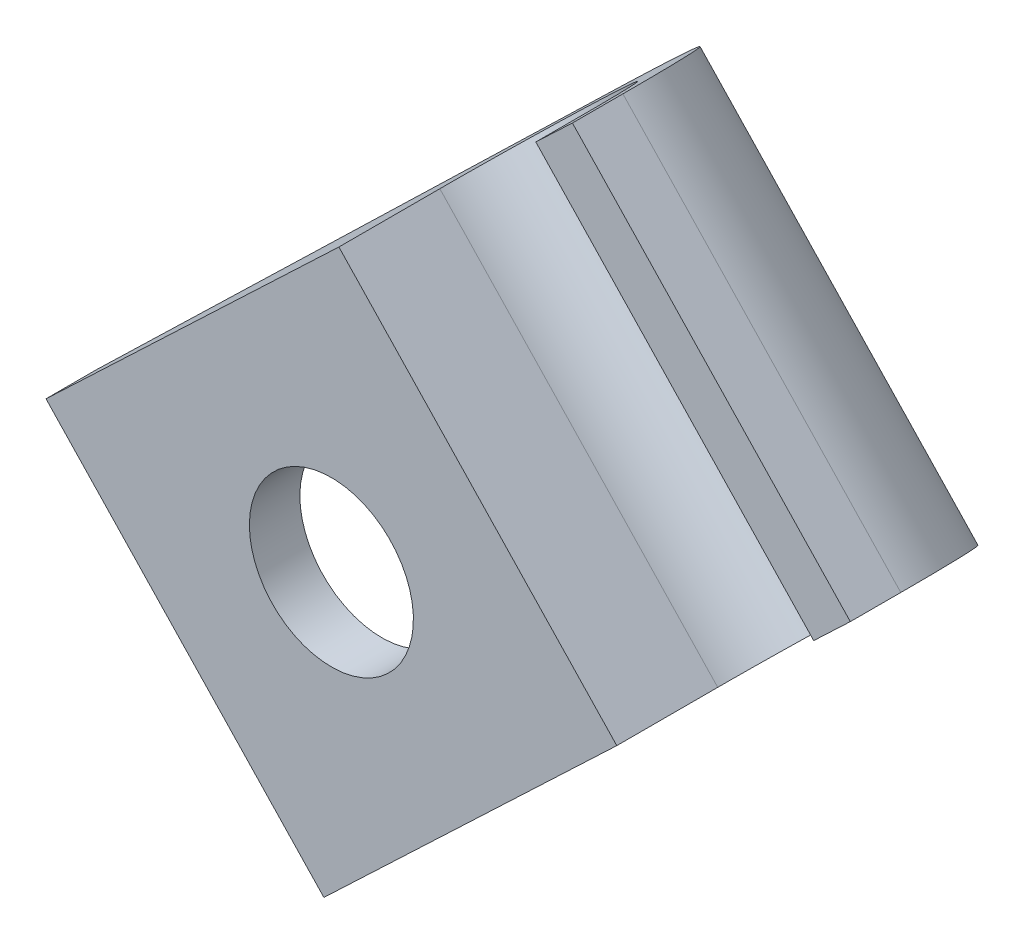
ISO-10303-21;
HEADER;
FILE_DESCRIPTION(('STEP AP214'),'2;1');
FILE_NAME('part.step','',(''),(''),'','','');
FILE_SCHEMA(('AUTOMOTIVE_DESIGN { 1 0 10303 214 1 1 1 1 }'));
ENDSEC;
DATA;
#1=APPLICATION_CONTEXT('core data for automotive mechanical design processes');
#2=APPLICATION_PROTOCOL_DEFINITION('international standard','automotive_design',2000,#1);
#3=PRODUCT_CONTEXT('',#1,'mechanical');
#4=PRODUCT('Part','Part','',(#3));
#5=PRODUCT_RELATED_PRODUCT_CATEGORY('part','',(#4));
#6=PRODUCT_DEFINITION_FORMATION('','',#4);
#7=PRODUCT_DEFINITION_CONTEXT('part definition',#1,'design');
#8=PRODUCT_DEFINITION('design','',#6,#7);
#9=PRODUCT_DEFINITION_SHAPE('','',#8);
#10=(LENGTH_UNIT() NAMED_UNIT(*) SI_UNIT(.MILLI.,.METRE.));
#11=(NAMED_UNIT(*) PLANE_ANGLE_UNIT() SI_UNIT($,.RADIAN.));
#12=(NAMED_UNIT(*) SI_UNIT($,.STERADIAN.) SOLID_ANGLE_UNIT());
#13=UNCERTAINTY_MEASURE_WITH_UNIT(LENGTH_MEASURE(1.E-05),#10,'distance_accuracy_value','');
#14=(GEOMETRIC_REPRESENTATION_CONTEXT(3) GLOBAL_UNCERTAINTY_ASSIGNED_CONTEXT((#13)) GLOBAL_UNIT_ASSIGNED_CONTEXT((#10,
#11,#12)) REPRESENTATION_CONTEXT('',''));
#15=CARTESIAN_POINT('',(0.,0.,0.));
#16=DIRECTION('',(0.,0.,1.));
#17=DIRECTION('',(1.,0.,0.));
#18=AXIS2_PLACEMENT_3D('',#15,#16,#17);
#19=CARTESIAN_POINT('',(51.5322097604457,74.4499868104123,323.969905252864));
#20=DIRECTION('',(0.688295322897612,-0.725430595217263,0.));
#21=DIRECTION('',(0.,1.13666811671174E-13,-1.));
#22=AXIS2_PLACEMENT_3D('',#19,#20,#21);
#23=PLANE('',#22);
#24=DIRECTION('',(0.667371945987254,0.633208734349789,-0.391996663828053));
#25=VECTOR('',#24,1.);
#26=CARTESIAN_POINT('',(43.4708622710946,66.8013050347125,330.319905252865));
#27=LINE('',#26,#25);
#28=CARTESIAN_POINT('',(43.4708622710946,66.8013050347125,330.319905252865));
#29=VERTEX_POINT('',#28);
#30=CARTESIAN_POINT('',(53.6327781179749,76.4430256833881,324.351064138057));
#31=VERTEX_POINT('',#30);
#32=EDGE_CURVE('E288',#29,#31,#27,.T.);
#33=ORIENTED_EDGE('',*,*,#32,.T.);
#34=CARTESIAN_POINT('',(54.9870729701685,77.7279932857121,328.732405252864));
#35=DIRECTION('',(0.688295322897612,-0.725430595217263,0.));
#36=DIRECTION('',(-0.725430595217263,-0.688295322897612,0.));
#37=AXIS2_PLACEMENT_3D('',#34,#35,#36);
#38=CIRCLE('',#37,4.7625);
#39=CARTESIAN_POINT('',(51.5322097604463,74.4499868104123,328.732405252864));
#40=VERTEX_POINT('',#39);
#41=EDGE_CURVE('E176',#40,#31,#38,.T.);
#42=ORIENTED_EDGE('',*,*,#41,.F.);
#43=DIRECTION('',(1.1872860521452E-13,0.,1.));
#44=VECTOR('',#43,1.);
#45=CARTESIAN_POINT('',(51.5322097604457,74.4499868104123,323.969905252864));
#46=LINE('',#45,#44);
#47=CARTESIAN_POINT('',(51.5322097604465,74.4499868104123,330.319905252864));
#48=VERTEX_POINT('',#47);
#49=EDGE_CURVE('E11',#40,#48,#46,.T.);
#50=ORIENTED_EDGE('',*,*,#49,.T.);
#51=DIRECTION('',(0.725430595217263,0.688295322897612,0.));
#52=VECTOR('',#51,1.);
#53=CARTESIAN_POINT('',(51.5322097604465,74.4499868104123,330.319905252864));
#54=LINE('',#53,#52);
#55=EDGE_CURVE('E205',#29,#48,#54,.T.);
#56=ORIENTED_EDGE('',*,*,#55,.F.);
#57=EDGE_LOOP('',(#33,#42,#50,#56));
#58=FACE_BOUND('',#57,.T.);
#59=ADVANCED_FACE('F16',(#58),#23,.T.);
#60=CARTESIAN_POINT('',(58.0882227110455,67.5402603909678,323.969905252863));
#61=DIRECTION('',(-0.688295322897612,0.725430595217263,0.));
#62=DIRECTION('',(1.19799423450876E-13,0.,1.));
#63=AXIS2_PLACEMENT_3D('',#60,#61,#62);
#64=PLANE('',#63);
#65=DIRECTION('',(-0.667371945987254,-0.633208734349789,0.391996663828053));
#66=VECTOR('',#65,1.);
#67=CARTESIAN_POINT('',(50.0268752216944,59.8915786152681,330.319905252864));
#68=LINE('',#67,#66);
#69=CARTESIAN_POINT('',(60.1887910685746,69.5332992639437,324.351064138056));
#70=VERTEX_POINT('',#69);
#71=CARTESIAN_POINT('',(50.0268752216944,59.8915786152681,330.319905252864));
#72=VERTEX_POINT('',#71);
#73=EDGE_CURVE('E209',#70,#72,#68,.T.);
#74=ORIENTED_EDGE('',*,*,#73,.T.);
#75=DIRECTION('',(-0.725430595217263,-0.688295322897612,0.));
#76=VECTOR('',#75,1.);
#77=CARTESIAN_POINT('',(58.0882227110462,67.5402603909678,330.319905252863));
#78=LINE('',#77,#76);
#79=CARTESIAN_POINT('',(58.0882227110462,67.5402603909678,330.319905252863));
#80=VERTEX_POINT('',#79);
#81=EDGE_CURVE('E217',#80,#72,#78,.T.);
#82=ORIENTED_EDGE('',*,*,#81,.F.);
#83=DIRECTION('',(1.1872860521452E-13,0.,1.));
#84=VECTOR('',#83,1.);
#85=CARTESIAN_POINT('',(58.0882227110455,67.5402603909678,323.969905252863));
#86=LINE('',#85,#84);
#87=CARTESIAN_POINT('',(58.0882227110461,67.5402603909678,328.732405252863));
#88=VERTEX_POINT('',#87);
#89=EDGE_CURVE('E27',#88,#80,#86,.T.);
#90=ORIENTED_EDGE('',*,*,#89,.F.);
#91=CARTESIAN_POINT('',(61.5430859207683,70.8182668662677,328.732405252863));
#92=DIRECTION('',(0.688295322897612,-0.725430595217263,0.));
#93=DIRECTION('',(0.725430595217263,0.688295322897612,0.));
#94=AXIS2_PLACEMENT_3D('',#91,#92,#93);
#95=CIRCLE('',#94,4.7625);
#96=EDGE_CURVE('E150',#88,#70,#95,.T.);
#97=ORIENTED_EDGE('',*,*,#96,.T.);
#98=EDGE_LOOP('',(#74,#82,#90,#97));
#99=FACE_BOUND('',#98,.T.);
#100=ADVANCED_FACE('F326',(#99),#64,.T.);
#101=CARTESIAN_POINT('',(51.5322097604457,74.4499868104123,323.969905252864));
#102=DIRECTION('',(-0.725430595217263,-0.688295322897612,0.));
#103=DIRECTION('',(-0.688295322897612,0.725430595217263,0.));
#104=AXIS2_PLACEMENT_3D('',#101,#102,#103);
#105=PLANE('',#104);
#106=DIRECTION('',(-0.688295322897612,0.725430595217263,0.));
#107=VECTOR('',#106,1.);
#108=CARTESIAN_POINT('',(61.702968713503,63.7304897054977,328.732405252863));
#109=LINE('',#108,#107);
#110=EDGE_CURVE('E260',#88,#40,#109,.T.);
#111=ORIENTED_EDGE('',*,*,#110,.F.);
#112=ORIENTED_EDGE('',*,*,#89,.T.);
#113=DIRECTION('',(0.688295322897612,-0.725430595217263,0.));
#114=VECTOR('',#113,1.);
#115=CARTESIAN_POINT('',(51.5322097604465,74.4499868104123,330.319905252864));
#116=LINE('',#115,#114);
#117=EDGE_CURVE('E221',#48,#80,#116,.T.);
#118=ORIENTED_EDGE('',*,*,#117,.F.);
#119=ORIENTED_EDGE('',*,*,#49,.F.);
#120=EDGE_LOOP('',(#111,#112,#118,#119));
#121=FACE_BOUND('',#120,.T.);
#122=ADVANCED_FACE('F332',(#121),#105,.T.);
#123=CARTESIAN_POINT('',(53.8944041450686,78.8796143556195,328.732405252864));
#124=DIRECTION('',(0.688295322897612,-0.725430595217263,0.));
#125=DIRECTION('',(0.,1.13666811671174E-13,-1.));
#126=AXIS2_PLACEMENT_3D('',#123,#124,#125);
#127=PLANE('',#126);
#128=CARTESIAN_POINT('',(53.8944041450686,78.8796143556195,328.732405252864));
#129=DIRECTION('',(-0.688295322897612,0.725430595217263,0.));
#130=DIRECTION('',(-0.725430595217263,-0.688295322897612,0.));
#131=AXIS2_PLACEMENT_3D('',#128,#129,#130);
#132=CIRCLE('',#131,3.175);
#133=CARTESIAN_POINT('',(56.1976462848834,81.0649520058194,328.732405252863));
#134=VERTEX_POINT('',#133);
#135=CARTESIAN_POINT('',(51.5911620052538,76.6942767054196,328.732405252864));
#136=VERTEX_POINT('',#135);
#137=EDGE_CURVE('E225',#134,#136,#132,.T.);
#138=ORIENTED_EDGE('',*,*,#137,.F.);
#139=DIRECTION('',(-1.1872860521452E-13,0.,-1.));
#140=VECTOR('',#139,1.);
#141=CARTESIAN_POINT('',(56.1976462848834,81.0649520058194,328.732405252863));
#142=LINE('',#141,#140);
#143=CARTESIAN_POINT('',(56.1976462848836,81.0649520058194,330.319905252864));
#144=VERTEX_POINT('',#143);
#145=EDGE_CURVE('E296',#144,#134,#142,.T.);
#146=ORIENTED_EDGE('',*,*,#145,.F.);
#147=DIRECTION('',(-0.725430595217263,-0.688295322897612,0.));
#148=VECTOR('',#147,1.);
#149=CARTESIAN_POINT('',(56.1976462848836,81.0649520058194,330.319905252864));
#150=LINE('',#149,#148);
#151=CARTESIAN_POINT('',(57.349267354791,82.1576208309194,330.319905252863));
#152=VERTEX_POINT('',#151);
#153=EDGE_CURVE('E170',#152,#144,#150,.T.);
#154=ORIENTED_EDGE('',*,*,#153,.F.);
#155=DIRECTION('',(1.1872860521452E-13,0.,1.));
#156=VECTOR('',#155,1.);
#157=CARTESIAN_POINT('',(57.349267354791,82.1576208309194,330.319905252863));
#158=LINE('',#157,#156);
#159=CARTESIAN_POINT('',(57.3492673547908,82.1576208309194,328.732405252863));
#160=VERTEX_POINT('',#159);
#161=EDGE_CURVE('E163',#160,#152,#158,.T.);
#162=ORIENTED_EDGE('',*,*,#161,.F.);
#163=CARTESIAN_POINT('',(53.8944041450686,78.8796143556195,328.732405252864));
#164=DIRECTION('',(0.688295322897612,-0.725430595217263,0.));
#165=DIRECTION('',(0.725430595217263,0.688295322897612,0.));
#166=AXIS2_PLACEMENT_3D('',#163,#164,#165);
#167=CIRCLE('',#166,4.7625);
#168=CARTESIAN_POINT('',(52.5401092928749,77.5946467532955,324.351064138057));
#169=VERTEX_POINT('',#168);
#170=EDGE_CURVE('E167',#169,#160,#167,.T.);
#171=ORIENTED_EDGE('',*,*,#170,.F.);
#172=DIRECTION('',(0.667371945987254,0.633208734349789,-0.391996663828053));
#173=VECTOR('',#172,1.);
#174=CARTESIAN_POINT('',(42.3781934459947,67.95292610462,330.319905252865));
#175=LINE('',#174,#173);
#176=CARTESIAN_POINT('',(42.3781934459947,67.95292610462,330.319905252865));
#177=VERTEX_POINT('',#176);
#178=EDGE_CURVE('E230',#177,#169,#175,.T.);
#179=ORIENTED_EDGE('',*,*,#178,.F.);
#180=DIRECTION('',(-1.1872860521452E-13,0.,-1.));
#181=VECTOR('',#180,1.);
#182=CARTESIAN_POINT('',(42.3781934459949,67.95292610462,331.907405252865));
#183=LINE('',#182,#181);
#184=CARTESIAN_POINT('',(42.3781934459949,67.95292610462,331.907405252865));
#185=VERTEX_POINT('',#184);
#186=EDGE_CURVE('E89',#185,#177,#183,.T.);
#187=ORIENTED_EDGE('',*,*,#186,.F.);
#188=DIRECTION('',(-0.725430595217263,-0.688295322897612,0.));
#189=VECTOR('',#188,1.);
#190=CARTESIAN_POINT('',(51.5911620052541,76.6942767054196,331.907405252864));
#191=LINE('',#190,#189);
#192=CARTESIAN_POINT('',(51.5911620052541,76.6942767054196,331.907405252864));
#193=VERTEX_POINT('',#192);
#194=EDGE_CURVE('E203',#193,#185,#191,.T.);
#195=ORIENTED_EDGE('',*,*,#194,.F.);
#196=DIRECTION('',(1.18530428602912E-13,0.,1.));
#197=VECTOR('',#196,1.);
#198=CARTESIAN_POINT('',(51.5911620052538,76.6942767054196,328.732405252864));
#199=LINE('',#198,#197);
#200=EDGE_CURVE('E236',#136,#193,#199,.T.);
#201=ORIENTED_EDGE('',*,*,#200,.F.);
#202=EDGE_LOOP('',(#138,#146,#154,#162,#171,#179,#187,#195,#201));
#203=FACE_BOUND('',#202,.T.);
#204=ADVANCED_FACE('F18',(#203),#127,.F.);
#205=CARTESIAN_POINT('',(62.6357547458682,69.6666457963603,328.732405252863));
#206=DIRECTION('',(0.688295322897612,-0.725430595217263,0.));
#207=DIRECTION('',(0.,1.13666811671174E-13,-1.));
#208=AXIS2_PLACEMENT_3D('',#205,#206,#207);
#209=PLANE('',#208);
#210=CARTESIAN_POINT('',(62.6357547458682,69.6666457963603,328.732405252863));
#211=DIRECTION('',(-0.688295322897612,0.725430595217263,0.));
#212=DIRECTION('',(-0.725430595217263,-0.688295322897612,0.));
#213=AXIS2_PLACEMENT_3D('',#210,#211,#212);
#214=CIRCLE('',#213,3.175);
#215=CARTESIAN_POINT('',(64.938996885683,71.8519834465602,328.732405252862));
#216=VERTEX_POINT('',#215);
#217=CARTESIAN_POINT('',(60.3325126060534,67.4813081461604,328.732405252863));
#218=VERTEX_POINT('',#217);
#219=EDGE_CURVE('E211',#216,#218,#214,.T.);
#220=ORIENTED_EDGE('',*,*,#219,.T.);
#221=DIRECTION('',(1.18530428602912E-13,0.,1.));
#222=VECTOR('',#221,1.);
#223=CARTESIAN_POINT('',(60.3325126060534,67.4813081461604,328.732405252863));
#224=LINE('',#223,#222);
#225=CARTESIAN_POINT('',(60.3325126060538,67.4813081461604,331.907405252863));
#226=VERTEX_POINT('',#225);
#227=EDGE_CURVE('E233',#218,#226,#224,.T.);
#228=ORIENTED_EDGE('',*,*,#227,.T.);
#229=DIRECTION('',(-0.725430595217263,-0.688295322897612,0.));
#230=VECTOR('',#229,1.);
#231=CARTESIAN_POINT('',(60.3325126060538,67.4813081461604,331.907405252863));
#232=LINE('',#231,#230);
#233=CARTESIAN_POINT('',(51.1195440467946,58.7399575453607,331.907405252864));
#234=VERTEX_POINT('',#233);
#235=EDGE_CURVE('E245',#226,#234,#232,.T.);
#236=ORIENTED_EDGE('',*,*,#235,.T.);
#237=DIRECTION('',(-1.1872860521452E-13,0.,-1.));
#238=VECTOR('',#237,1.);
#239=CARTESIAN_POINT('',(51.1195440467946,58.7399575453607,331.907405252864));
#240=LINE('',#239,#238);
#241=CARTESIAN_POINT('',(51.1195440467944,58.7399575453607,330.319905252864));
#242=VERTEX_POINT('',#241);
#243=EDGE_CURVE('E101',#234,#242,#240,.T.);
#244=ORIENTED_EDGE('',*,*,#243,.T.);
#245=DIRECTION('',(0.667371945987254,0.633208734349789,-0.391996663828053));
#246=VECTOR('',#245,1.);
#247=CARTESIAN_POINT('',(51.1195440467944,58.7399575453607,330.319905252864));
#248=LINE('',#247,#246);
#249=CARTESIAN_POINT('',(61.2814598936746,68.3816781940363,324.351064138056));
#250=VERTEX_POINT('',#249);
#251=EDGE_CURVE('E248',#242,#250,#248,.T.);
#252=ORIENTED_EDGE('',*,*,#251,.T.);
#253=CARTESIAN_POINT('',(62.6357547458682,69.6666457963603,328.732405252863));
#254=DIRECTION('',(0.688295322897612,-0.725430595217263,0.));
#255=DIRECTION('',(0.725430595217263,0.688295322897612,0.));
#256=AXIS2_PLACEMENT_3D('',#253,#254,#255);
#257=CIRCLE('',#256,4.7625);
#258=CARTESIAN_POINT('',(66.0906179555904,72.9446522716602,328.732405252862));
#259=VERTEX_POINT('',#258);
#260=EDGE_CURVE('E186',#250,#259,#257,.T.);
#261=ORIENTED_EDGE('',*,*,#260,.T.);
#262=DIRECTION('',(1.1872860521452E-13,0.,1.));
#263=VECTOR('',#262,1.);
#264=CARTESIAN_POINT('',(66.0906179555906,72.9446522716602,330.319905252862));
#265=LINE('',#264,#263);
#266=CARTESIAN_POINT('',(66.0906179555906,72.9446522716602,330.319905252862));
#267=VERTEX_POINT('',#266);
#268=EDGE_CURVE('E182',#259,#267,#265,.T.);
#269=ORIENTED_EDGE('',*,*,#268,.T.);
#270=DIRECTION('',(-0.725430595217263,-0.688295322897612,0.));
#271=VECTOR('',#270,1.);
#272=CARTESIAN_POINT('',(64.9389968856832,71.8519834465602,330.319905252863));
#273=LINE('',#272,#271);
#274=CARTESIAN_POINT('',(64.9389968856832,71.8519834465602,330.319905252863));
#275=VERTEX_POINT('',#274);
#276=EDGE_CURVE('E299',#267,#275,#273,.T.);
#277=ORIENTED_EDGE('',*,*,#276,.T.);
#278=DIRECTION('',(-1.1872860521452E-13,0.,-1.));
#279=VECTOR('',#278,1.);
#280=CARTESIAN_POINT('',(64.938996885683,71.8519834465602,328.732405252862));
#281=LINE('',#280,#279);
#282=EDGE_CURVE('E41',#275,#216,#281,.T.);
#283=ORIENTED_EDGE('',*,*,#282,.T.);
#284=EDGE_LOOP('',(#220,#228,#236,#244,#252,#261,#269,#277,#283));
#285=FACE_BOUND('',#284,.T.);
#286=ADVANCED_FACE('F322',(#285),#209,.T.);
#287=CARTESIAN_POINT('',(64.938996885683,71.8519834465602,328.732405252862));
#288=DIRECTION('',(0.725430595217263,0.688295322897612,0.));
#289=DIRECTION('',(0.,-1.24118311207363E-13,-1.));
#290=AXIS2_PLACEMENT_3D('',#287,#288,#289);
#291=PLANE('',#290);
#292=ORIENTED_EDGE('',*,*,#145,.T.);
#293=DIRECTION('',(-0.688295322897612,0.725430595217263,0.));
#294=VECTOR('',#293,1.);
#295=CARTESIAN_POINT('',(64.938996885683,71.8519834465602,328.732405252862));
#296=LINE('',#295,#294);
#297=EDGE_CURVE('E215',#216,#134,#296,.T.);
#298=ORIENTED_EDGE('',*,*,#297,.F.);
#299=ORIENTED_EDGE('',*,*,#282,.F.);
#300=DIRECTION('',(-0.688295322897612,0.725430595217263,0.));
#301=VECTOR('',#300,1.);
#302=CARTESIAN_POINT('',(64.9389968856832,71.8519834465602,330.319905252863));
#303=LINE('',#302,#301);
#304=EDGE_CURVE('E241',#275,#144,#303,.T.);
#305=ORIENTED_EDGE('',*,*,#304,.T.);
#306=EDGE_LOOP('',(#292,#298,#299,#305));
#307=FACE_BOUND('',#306,.T.);
#308=ADVANCED_FACE('F309',(#307),#291,.F.);
#309=CARTESIAN_POINT('',(64.9389968856832,71.8519834465602,330.319905252863));
#310=DIRECTION('',(-1.18629516908716E-13,0.,-1.));
#311=DIRECTION('',(-1.,0.,1.18629516908716E-13));
#312=AXIS2_PLACEMENT_3D('',#309,#310,#311);
#313=PLANE('',#312);
#314=ORIENTED_EDGE('',*,*,#153,.T.);
#315=ORIENTED_EDGE('',*,*,#304,.F.);
#316=ORIENTED_EDGE('',*,*,#276,.F.);
#317=DIRECTION('',(-0.688295322897612,0.725430595217263,0.));
#318=VECTOR('',#317,1.);
#319=CARTESIAN_POINT('',(66.0906179555906,72.9446522716602,330.319905252862));
#320=LINE('',#319,#318);
#321=EDGE_CURVE('E175',#267,#152,#320,.T.);
#322=ORIENTED_EDGE('',*,*,#321,.T.);
#323=EDGE_LOOP('',(#314,#315,#316,#322));
#324=FACE_BOUND('',#323,.T.);
#325=ADVANCED_FACE('F313',(#324),#313,.F.);
#326=CARTESIAN_POINT('',(66.0906179555906,72.9446522716602,330.319905252862));
#327=DIRECTION('',(-0.725430595217263,-0.688295322897612,0.));
#328=DIRECTION('',(-0.688295322897612,0.725430595217263,0.));
#329=AXIS2_PLACEMENT_3D('',#326,#327,#328);
#330=PLANE('',#329);
#331=ORIENTED_EDGE('',*,*,#161,.T.);
#332=ORIENTED_EDGE('',*,*,#321,.F.);
#333=ORIENTED_EDGE('',*,*,#268,.F.);
#334=DIRECTION('',(-0.688295322897612,0.725430595217263,0.));
#335=VECTOR('',#334,1.);
#336=CARTESIAN_POINT('',(66.0906179555904,72.9446522716602,328.732405252862));
#337=LINE('',#336,#335);
#338=EDGE_CURVE('E179',#259,#160,#337,.T.);
#339=ORIENTED_EDGE('',*,*,#338,.T.);
#340=EDGE_LOOP('',(#331,#332,#333,#339));
#341=FACE_BOUND('',#340,.T.);
#342=ADVANCED_FACE('F180',(#341),#330,.F.);
#343=CARTESIAN_POINT('',(62.6357547458682,69.6666457963603,328.732405252863));
#344=DIRECTION('',(-0.688295322897612,0.725430595217263,0.));
#345=DIRECTION('',(0.725430595217263,0.688295322897612,0.));
#346=AXIS2_PLACEMENT_3D('',#343,#344,#345);
#347=CYLINDRICAL_SURFACE('',#346,4.7625);
#348=ORIENTED_EDGE('',*,*,#170,.T.);
#349=ORIENTED_EDGE('',*,*,#338,.F.);
#350=ORIENTED_EDGE('',*,*,#260,.F.);
#351=DIRECTION('',(-0.688295322897612,0.725430595217263,0.));
#352=VECTOR('',#351,1.);
#353=CARTESIAN_POINT('',(61.2814598936746,68.3816781940363,324.351064138056));
#354=LINE('',#353,#352);
#355=EDGE_CURVE('E253',#250,#70,#354,.T.);
#356=ORIENTED_EDGE('',*,*,#355,.T.);
#357=ORIENTED_EDGE('',*,*,#96,.F.);
#358=ORIENTED_EDGE('',*,*,#110,.T.);
#359=ORIENTED_EDGE('',*,*,#41,.T.);
#360=DIRECTION('',(-0.688295322897612,0.725430595217263,0.));
#361=VECTOR('',#360,1.);
#362=CARTESIAN_POINT('',(61.2814598936746,68.3816781940363,324.351064138056));
#363=LINE('',#362,#361);
#364=EDGE_CURVE('E20',#31,#169,#363,.T.);
#365=ORIENTED_EDGE('',*,*,#364,.T.);
#366=EDGE_LOOP('',(#348,#349,#350,#356,#357,#358,#359,#365));
#367=FACE_BOUND('',#366,.T.);
#368=ADVANCED_FACE('F189',(#367),#347,.T.);
#369=CARTESIAN_POINT('',(51.1195440467946,58.7399575453607,331.907405252864));
#370=DIRECTION('',(0.725430595217263,0.688295322897612,0.));
#371=DIRECTION('',(0.,-1.24118311207363E-13,-1.));
#372=AXIS2_PLACEMENT_3D('',#369,#370,#371);
#373=PLANE('',#372);
#374=ORIENTED_EDGE('',*,*,#186,.T.);
#375=DIRECTION('',(-0.688295322897612,0.725430595217263,0.));
#376=VECTOR('',#375,1.);
#377=CARTESIAN_POINT('',(51.1195440467944,58.7399575453607,330.319905252864));
#378=LINE('',#377,#376);
#379=EDGE_CURVE('E138',#29,#177,#378,.T.);
#380=ORIENTED_EDGE('',*,*,#379,.F.);
#381=DIRECTION('',(-0.688295322897612,0.725430595217263,0.));
#382=VECTOR('',#381,1.);
#383=CARTESIAN_POINT('',(43.4708622710946,66.8013050347125,330.319905252865));
#384=LINE('',#383,#382);
#385=EDGE_CURVE('E210',#72,#29,#384,.T.);
#386=ORIENTED_EDGE('',*,*,#385,.F.);
#387=DIRECTION('',(-0.688295322897612,0.725430595217263,0.));
#388=VECTOR('',#387,1.);
#389=CARTESIAN_POINT('',(51.1195440467944,58.7399575453607,330.319905252864));
#390=LINE('',#389,#388);
#391=EDGE_CURVE('E246',#242,#72,#390,.T.);
#392=ORIENTED_EDGE('',*,*,#391,.F.);
#393=ORIENTED_EDGE('',*,*,#243,.F.);
#394=DIRECTION('',(-0.688295322897612,0.725430595217263,0.));
#395=VECTOR('',#394,1.);
#396=CARTESIAN_POINT('',(51.1195440467946,58.7399575453607,331.907405252864));
#397=LINE('',#396,#395);
#398=EDGE_CURVE('E242',#234,#185,#397,.T.);
#399=ORIENTED_EDGE('',*,*,#398,.T.);
#400=EDGE_LOOP('',(#374,#380,#386,#392,#393,#399));
#401=FACE_BOUND('',#400,.T.);
#402=ADVANCED_FACE('F368',(#401),#373,.F.);
#403=CARTESIAN_POINT('',(60.3325126060534,67.4813081461604,328.732405252863));
#404=DIRECTION('',(-0.725430595217263,-0.688295322897612,0.));
#405=DIRECTION('',(-0.688295322897612,0.725430595217263,0.));
#406=AXIS2_PLACEMENT_3D('',#403,#404,#405);
#407=PLANE('',#406);
#408=ORIENTED_EDGE('',*,*,#200,.T.);
#409=DIRECTION('',(-0.688295322897612,0.725430595217263,0.));
#410=VECTOR('',#409,1.);
#411=CARTESIAN_POINT('',(60.3325126060538,67.4813081461604,331.907405252863));
#412=LINE('',#411,#410);
#413=EDGE_CURVE('E256',#226,#193,#412,.T.);
#414=ORIENTED_EDGE('',*,*,#413,.F.);
#415=ORIENTED_EDGE('',*,*,#227,.F.);
#416=DIRECTION('',(-0.688295322897612,0.725430595217263,0.));
#417=VECTOR('',#416,1.);
#418=CARTESIAN_POINT('',(60.3325126060534,67.4813081461604,328.732405252863));
#419=LINE('',#418,#417);
#420=EDGE_CURVE('E216',#218,#136,#419,.T.);
#421=ORIENTED_EDGE('',*,*,#420,.T.);
#422=EDGE_LOOP('',(#408,#414,#415,#421));
#423=FACE_BOUND('',#422,.T.);
#424=ADVANCED_FACE('F385',(#423),#407,.F.);
#425=CARTESIAN_POINT('',(62.6357547458682,69.6666457963603,328.732405252863));
#426=DIRECTION('',(-0.688295322897612,0.725430595217263,0.));
#427=DIRECTION('',(0.725430595217263,0.688295322897612,0.));
#428=AXIS2_PLACEMENT_3D('',#425,#426,#427);
#429=CYLINDRICAL_SURFACE('',#428,3.175);
#430=ORIENTED_EDGE('',*,*,#137,.T.);
#431=ORIENTED_EDGE('',*,*,#420,.F.);
#432=ORIENTED_EDGE('',*,*,#219,.F.);
#433=ORIENTED_EDGE('',*,*,#297,.T.);
#434=EDGE_LOOP('',(#430,#431,#432,#433));
#435=FACE_BOUND('',#434,.T.);
#436=ADVANCED_FACE('F305',(#435),#429,.F.);
#437=CARTESIAN_POINT('',(51.1195440467944,58.7399575453607,330.319905252864));
#438=DIRECTION('',(0.284366373164018,0.269809470304261,0.919966638279713));
#439=DIRECTION('',(0.688295322897471,-0.725430595217397,0.));
#440=AXIS2_PLACEMENT_3D('',#437,#438,#439);
#441=PLANE('',#440);
#442=ORIENTED_EDGE('',*,*,#364,.F.);
#443=ORIENTED_EDGE('',*,*,#32,.F.);
#444=ORIENTED_EDGE('',*,*,#379,.T.);
#445=ORIENTED_EDGE('',*,*,#178,.T.);
#446=EDGE_LOOP('',(#442,#443,#444,#445));
#447=FACE_BOUND('',#446,.T.);
#448=ADVANCED_FACE('F339',(#447),#441,.F.);
#449=CARTESIAN_POINT('',(51.1195440467944,58.7399575453607,330.319905252864));
#450=DIRECTION('',(0.284366373164018,0.269809470304261,0.919966638279713));
#451=DIRECTION('',(0.688295322897471,-0.725430595217397,0.));
#452=AXIS2_PLACEMENT_3D('',#449,#450,#451);
#453=PLANE('',#452);
#454=ORIENTED_EDGE('',*,*,#73,.F.);
#455=ORIENTED_EDGE('',*,*,#355,.F.);
#456=ORIENTED_EDGE('',*,*,#251,.F.);
#457=ORIENTED_EDGE('',*,*,#391,.T.);
#458=EDGE_LOOP('',(#454,#455,#456,#457));
#459=FACE_BOUND('',#458,.T.);
#460=ADVANCED_FACE('F336',(#459),#453,.F.);
#461=CARTESIAN_POINT('',(58.0882227110462,67.5402603909678,330.319905252863));
#462=DIRECTION('',(-1.1872860521452E-13,0.,-1.));
#463=DIRECTION('',(-1.,0.,1.1872860521452E-13));
#464=AXIS2_PLACEMENT_3D('',#461,#462,#463);
#465=PLANE('',#464);
#466=CARTESIAN_POINT('',(51.3553530260241,67.7171171253902,330.319905252864));
#467=DIRECTION('',(1.1872860521452E-13,0.,1.));
#468=DIRECTION('',(0.688295322897629,-0.725430595217247,0.));
#469=AXIS2_PLACEMENT_3D('',#466,#467,#468);
#470=CIRCLE('',#469,2.5796875);
#471=CARTESIAN_POINT('',(53.1309398668116,65.8457328867906,330.319905252864));
#472=VERTEX_POINT('',#471);
#473=EDGE_CURVE('E229',#472,#472,#470,.T.);
#474=ORIENTED_EDGE('',*,*,#473,.T.);
#475=EDGE_LOOP('',(#474));
#476=FACE_BOUND('',#475,.T.);
#477=ORIENTED_EDGE('',*,*,#117,.T.);
#478=ORIENTED_EDGE('',*,*,#81,.T.);
#479=ORIENTED_EDGE('',*,*,#385,.T.);
#480=ORIENTED_EDGE('',*,*,#55,.T.);
#481=EDGE_LOOP('',(#477,#478,#479,#480));
#482=FACE_BOUND('',#481,.T.);
#483=ADVANCED_FACE('F342',(#476,#482),#465,.T.);
#484=CARTESIAN_POINT('',(60.3325126060538,67.4813081461604,331.907405252863));
#485=DIRECTION('',(-1.18639765588877E-13,0.,-1.));
#486=DIRECTION('',(-1.,0.,1.18639765588877E-13));
#487=AXIS2_PLACEMENT_3D('',#484,#485,#486);
#488=PLANE('',#487);
#489=CARTESIAN_POINT('',(51.3553530260243,67.7171171253902,331.907405252864));
#490=DIRECTION('',(-1.1872860521452E-13,0.,-1.));
#491=DIRECTION('',(0.688295322897612,-0.725430595217262,0.));
#492=AXIS2_PLACEMENT_3D('',#489,#490,#491);
#493=CIRCLE('',#492,2.5796875);
#494=CARTESIAN_POINT('',(53.1309398668118,65.8457328867906,331.907405252864));
#495=VERTEX_POINT('',#494);
#496=EDGE_CURVE('E201',#495,#495,#493,.T.);
#497=ORIENTED_EDGE('',*,*,#496,.T.);
#498=EDGE_LOOP('',(#497));
#499=FACE_BOUND('',#498,.T.);
#500=ORIENTED_EDGE('',*,*,#194,.T.);
#501=ORIENTED_EDGE('',*,*,#398,.F.);
#502=ORIENTED_EDGE('',*,*,#235,.F.);
#503=ORIENTED_EDGE('',*,*,#413,.T.);
#504=EDGE_LOOP('',(#500,#501,#502,#503));
#505=FACE_BOUND('',#504,.T.);
#506=ADVANCED_FACE('F344',(#499,#505),#488,.F.);
#507=CARTESIAN_POINT('',(51.355353026024,67.7171171253902,329.367405252864));
#508=DIRECTION('',(1.1872860521452E-13,0.,1.));
#509=DIRECTION('',(-0.688295322897612,0.725430595217262,0.));
#510=AXIS2_PLACEMENT_3D('',#507,#508,#509);
#511=CYLINDRICAL_SURFACE('',#510,2.5796875);
#512=ORIENTED_EDGE('',*,*,#473,.F.);
#513=DIRECTION('',(1.1872860521452E-13,0.,1.));
#514=VECTOR('',#513,1.);
#515=CARTESIAN_POINT('',(53.1309398668115,65.8457328867906,329.367405252864));
#516=LINE('',#515,#514);
#517=EDGE_CURVE('E204',#472,#495,#516,.T.);
#518=ORIENTED_EDGE('',*,*,#517,.T.);
#519=ORIENTED_EDGE('',*,*,#496,.F.);
#520=ORIENTED_EDGE('',*,*,#517,.F.);
#521=EDGE_LOOP('',(#512,#518,#519,#520));
#522=FACE_BOUND('',#521,.T.);
#523=ADVANCED_FACE('F350',(#522),#511,.F.);
#524=CLOSED_SHELL('',(#59,#100,#122,#204,#286,#308,#325,#342,#368,#402,#424,#436,#448,#460,#483,
#506,#523));
#525=MANIFOLD_SOLID_BREP('B1',#524);
#526=ADVANCED_BREP_SHAPE_REPRESENTATION('',(#18,#525),#14);
#527=SHAPE_DEFINITION_REPRESENTATION(#9,#526);
ENDSEC;
END-ISO-10303-21;
